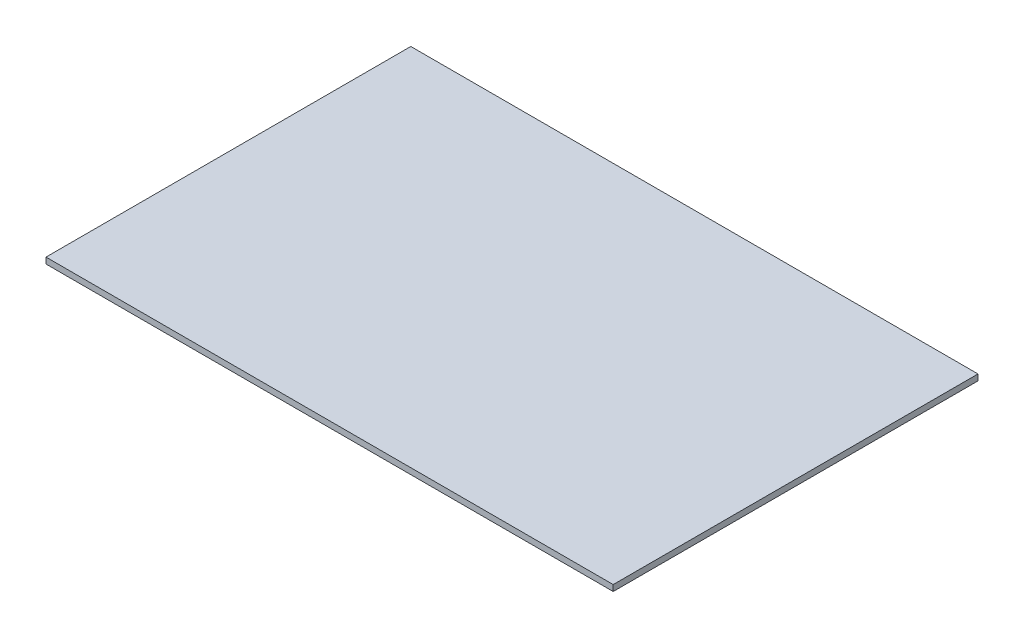
ISO-10303-21;
HEADER;
FILE_DESCRIPTION(('STEP AP214'),'2;1');
FILE_NAME('part.step','',(''),(''),'','','');
FILE_SCHEMA(('AUTOMOTIVE_DESIGN { 1 0 10303 214 1 1 1 1 }'));
ENDSEC;
DATA;
#1=APPLICATION_CONTEXT('core data for automotive mechanical design processes');
#2=APPLICATION_PROTOCOL_DEFINITION('international standard','automotive_design',2000,#1);
#3=PRODUCT_CONTEXT('',#1,'mechanical');
#4=PRODUCT('Part','Part','',(#3));
#5=PRODUCT_RELATED_PRODUCT_CATEGORY('part','',(#4));
#6=PRODUCT_DEFINITION_FORMATION('','',#4);
#7=PRODUCT_DEFINITION_CONTEXT('part definition',#1,'design');
#8=PRODUCT_DEFINITION('design','',#6,#7);
#9=PRODUCT_DEFINITION_SHAPE('','',#8);
#10=(LENGTH_UNIT() NAMED_UNIT(*) SI_UNIT(.MILLI.,.METRE.));
#11=(NAMED_UNIT(*) PLANE_ANGLE_UNIT() SI_UNIT($,.RADIAN.));
#12=(NAMED_UNIT(*) SI_UNIT($,.STERADIAN.) SOLID_ANGLE_UNIT());
#13=UNCERTAINTY_MEASURE_WITH_UNIT(LENGTH_MEASURE(1.E-05),#10,'distance_accuracy_value','');
#14=(GEOMETRIC_REPRESENTATION_CONTEXT(3) GLOBAL_UNCERTAINTY_ASSIGNED_CONTEXT((#13)) GLOBAL_UNIT_ASSIGNED_CONTEXT((#10,
#11,#12)) REPRESENTATION_CONTEXT('',''));
#15=CARTESIAN_POINT('',(0.,0.,0.));
#16=DIRECTION('',(0.,0.,1.));
#17=DIRECTION('',(1.,0.,0.));
#18=AXIS2_PLACEMENT_3D('',#15,#16,#17);
#19=CARTESIAN_POINT('',(404.8125,8.636,-260.35));
#20=DIRECTION('',(-1.,0.,0.));
#21=DIRECTION('',(0.,0.,1.));
#22=AXIS2_PLACEMENT_3D('',#19,#20,#21);
#23=PLANE('',#22);
#24=DIRECTION('',(0.,0.,-1.));
#25=VECTOR('',#24,1.);
#26=CARTESIAN_POINT('',(404.8125,0.,-260.35));
#27=LINE('',#26,#25);
#28=CARTESIAN_POINT('',(404.8125,0.,260.35));
#29=VERTEX_POINT('',#28);
#30=CARTESIAN_POINT('',(404.8125,0.,-260.35));
#31=VERTEX_POINT('',#30);
#32=EDGE_CURVE('E109',#29,#31,#27,.T.);
#33=ORIENTED_EDGE('',*,*,#32,.T.);
#34=DIRECTION('',(0.,-1.,0.));
#35=VECTOR('',#34,1.);
#36=CARTESIAN_POINT('',(404.8125,8.636,-260.35));
#37=LINE('',#36,#35);
#38=CARTESIAN_POINT('',(404.8125,8.636,-260.35));
#39=VERTEX_POINT('',#38);
#40=EDGE_CURVE('E11',#39,#31,#37,.T.);
#41=ORIENTED_EDGE('',*,*,#40,.F.);
#42=DIRECTION('',(0.,0.,-1.));
#43=VECTOR('',#42,1.);
#44=CARTESIAN_POINT('',(404.8125,8.636,-260.35));
#45=LINE('',#44,#43);
#46=CARTESIAN_POINT('',(404.8125,8.636,260.35));
#47=VERTEX_POINT('',#46);
#48=EDGE_CURVE('E93',#47,#39,#45,.T.);
#49=ORIENTED_EDGE('',*,*,#48,.F.);
#50=DIRECTION('',(0.,-1.,0.));
#51=VECTOR('',#50,1.);
#52=CARTESIAN_POINT('',(404.8125,8.636,260.35));
#53=LINE('',#52,#51);
#54=EDGE_CURVE('E105',#47,#29,#53,.T.);
#55=ORIENTED_EDGE('',*,*,#54,.T.);
#56=EDGE_LOOP('',(#33,#41,#49,#55));
#57=FACE_BOUND('',#56,.T.);
#58=ADVANCED_FACE('F41',(#57),#23,.F.);
#59=CARTESIAN_POINT('',(-404.8125,8.636,-260.35));
#60=DIRECTION('',(0.,0.,1.));
#61=DIRECTION('',(1.,0.,0.));
#62=AXIS2_PLACEMENT_3D('',#59,#60,#61);
#63=PLANE('',#62);
#64=DIRECTION('',(-1.,0.,0.));
#65=VECTOR('',#64,1.);
#66=CARTESIAN_POINT('',(-404.8125,0.,-260.35));
#67=LINE('',#66,#65);
#68=CARTESIAN_POINT('',(-404.8125,0.,-260.35));
#69=VERTEX_POINT('',#68);
#70=EDGE_CURVE('E98',#31,#69,#67,.T.);
#71=ORIENTED_EDGE('',*,*,#70,.T.);
#72=DIRECTION('',(0.,-1.,0.));
#73=VECTOR('',#72,1.);
#74=CARTESIAN_POINT('',(-404.8125,8.636,-260.35));
#75=LINE('',#74,#73);
#76=CARTESIAN_POINT('',(-404.8125,8.636,-260.35));
#77=VERTEX_POINT('',#76);
#78=EDGE_CURVE('E50',#77,#69,#75,.T.);
#79=ORIENTED_EDGE('',*,*,#78,.F.);
#80=DIRECTION('',(-1.,0.,0.));
#81=VECTOR('',#80,1.);
#82=CARTESIAN_POINT('',(-404.8125,8.636,-260.35));
#83=LINE('',#82,#81);
#84=EDGE_CURVE('E88',#39,#77,#83,.T.);
#85=ORIENTED_EDGE('',*,*,#84,.F.);
#86=ORIENTED_EDGE('',*,*,#40,.T.);
#87=EDGE_LOOP('',(#71,#79,#85,#86));
#88=FACE_BOUND('',#87,.T.);
#89=ADVANCED_FACE('F97',(#88),#63,.F.);
#90=CARTESIAN_POINT('',(-404.8125,8.636,-260.35));
#91=DIRECTION('',(1.,0.,0.));
#92=DIRECTION('',(0.,0.,-1.));
#93=AXIS2_PLACEMENT_3D('',#90,#91,#92);
#94=PLANE('',#93);
#95=DIRECTION('',(0.,0.,1.));
#96=VECTOR('',#95,1.);
#97=CARTESIAN_POINT('',(-404.8125,0.,-260.35));
#98=LINE('',#97,#96);
#99=CARTESIAN_POINT('',(-404.8125,0.,260.35));
#100=VERTEX_POINT('',#99);
#101=EDGE_CURVE('E75',#69,#100,#98,.T.);
#102=ORIENTED_EDGE('',*,*,#101,.T.);
#103=DIRECTION('',(0.,-1.,0.));
#104=VECTOR('',#103,1.);
#105=CARTESIAN_POINT('',(-404.8125,8.636,260.35));
#106=LINE('',#105,#104);
#107=CARTESIAN_POINT('',(-404.8125,8.636,260.35));
#108=VERTEX_POINT('',#107);
#109=EDGE_CURVE('E100',#108,#100,#106,.T.);
#110=ORIENTED_EDGE('',*,*,#109,.F.);
#111=DIRECTION('',(0.,0.,1.));
#112=VECTOR('',#111,1.);
#113=CARTESIAN_POINT('',(-404.8125,8.636,-260.35));
#114=LINE('',#113,#112);
#115=EDGE_CURVE('E91',#77,#108,#114,.T.);
#116=ORIENTED_EDGE('',*,*,#115,.F.);
#117=ORIENTED_EDGE('',*,*,#78,.T.);
#118=EDGE_LOOP('',(#102,#110,#116,#117));
#119=FACE_BOUND('',#118,.T.);
#120=ADVANCED_FACE('F101',(#119),#94,.F.);
#121=CARTESIAN_POINT('',(-404.8125,8.636,260.35));
#122=DIRECTION('',(0.,0.,-1.));
#123=DIRECTION('',(-1.,0.,0.));
#124=AXIS2_PLACEMENT_3D('',#121,#122,#123);
#125=PLANE('',#124);
#126=DIRECTION('',(1.,0.,0.));
#127=VECTOR('',#126,1.);
#128=CARTESIAN_POINT('',(-404.8125,0.,260.35));
#129=LINE('',#128,#127);
#130=EDGE_CURVE('E81',#100,#29,#129,.T.);
#131=ORIENTED_EDGE('',*,*,#130,.T.);
#132=ORIENTED_EDGE('',*,*,#54,.F.);
#133=DIRECTION('',(1.,0.,0.));
#134=VECTOR('',#133,1.);
#135=CARTESIAN_POINT('',(-404.8125,8.636,260.35));
#136=LINE('',#135,#134);
#137=EDGE_CURVE('E58',#108,#47,#136,.T.);
#138=ORIENTED_EDGE('',*,*,#137,.F.);
#139=ORIENTED_EDGE('',*,*,#109,.T.);
#140=EDGE_LOOP('',(#131,#132,#138,#139));
#141=FACE_BOUND('',#140,.T.);
#142=ADVANCED_FACE('F122',(#141),#125,.F.);
#143=CARTESIAN_POINT('',(0.,8.636,0.));
#144=DIRECTION('',(0.,1.,0.));
#145=DIRECTION('',(0.,0.,1.));
#146=AXIS2_PLACEMENT_3D('',#143,#144,#145);
#147=PLANE('',#146);
#148=ORIENTED_EDGE('',*,*,#48,.T.);
#149=ORIENTED_EDGE('',*,*,#84,.T.);
#150=ORIENTED_EDGE('',*,*,#115,.T.);
#151=ORIENTED_EDGE('',*,*,#137,.T.);
#152=EDGE_LOOP('',(#148,#149,#150,#151));
#153=FACE_BOUND('',#152,.T.);
#154=ADVANCED_FACE('F89',(#153),#147,.T.);
#155=CARTESIAN_POINT('',(0.,0.,0.));
#156=DIRECTION('',(0.,1.,0.));
#157=DIRECTION('',(0.,0.,1.));
#158=AXIS2_PLACEMENT_3D('',#155,#156,#157);
#159=PLANE('',#158);
#160=ORIENTED_EDGE('',*,*,#32,.F.);
#161=ORIENTED_EDGE('',*,*,#130,.F.);
#162=ORIENTED_EDGE('',*,*,#101,.F.);
#163=ORIENTED_EDGE('',*,*,#70,.F.);
#164=EDGE_LOOP('',(#160,#161,#162,#163));
#165=FACE_BOUND('',#164,.T.);
#166=ADVANCED_FACE('F125',(#165),#159,.F.);
#167=CLOSED_SHELL('',(#58,#89,#120,#142,#154,#166));
#168=MANIFOLD_SOLID_BREP('B2',#167);
#169=ADVANCED_BREP_SHAPE_REPRESENTATION('',(#18,#168),#14);
#170=SHAPE_DEFINITION_REPRESENTATION(#9,#169);
ENDSEC;
END-ISO-10303-21;
